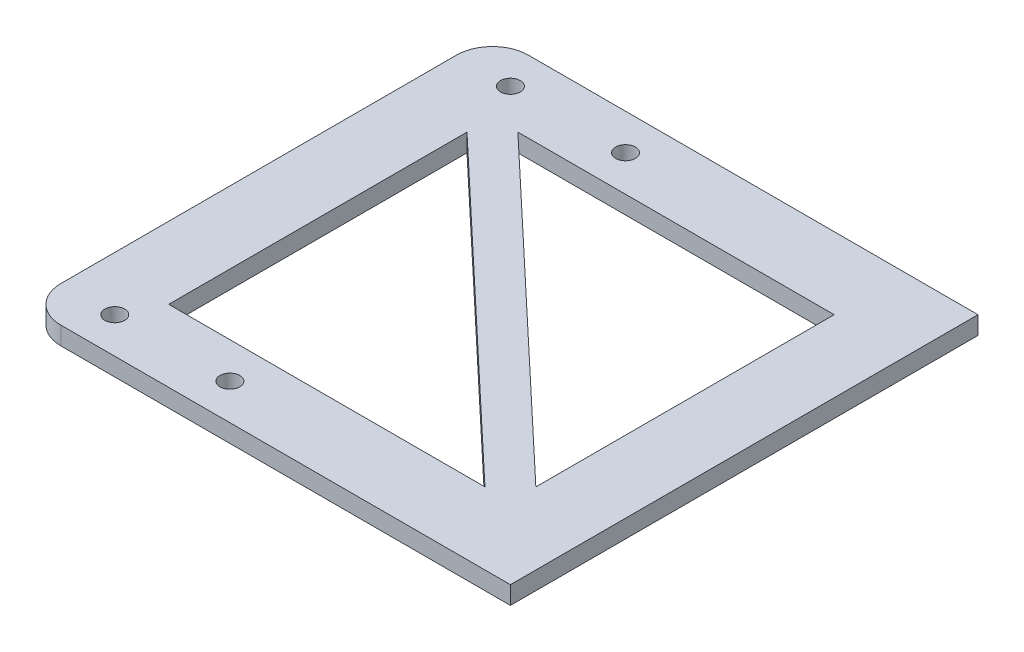
ISO-10303-21;
HEADER;
FILE_DESCRIPTION(('STEP AP214'),'2;1');
FILE_NAME('part.step','',(''),(''),'','','');
FILE_SCHEMA(('AUTOMOTIVE_DESIGN { 1 0 10303 214 1 1 1 1 }'));
ENDSEC;
DATA;
#1=APPLICATION_CONTEXT('core data for automotive mechanical design processes');
#2=APPLICATION_PROTOCOL_DEFINITION('international standard','automotive_design',2000,#1);
#3=PRODUCT_CONTEXT('',#1,'mechanical');
#4=PRODUCT('Part','Part','',(#3));
#5=PRODUCT_RELATED_PRODUCT_CATEGORY('part','',(#4));
#6=PRODUCT_DEFINITION_FORMATION('','',#4);
#7=PRODUCT_DEFINITION_CONTEXT('part definition',#1,'design');
#8=PRODUCT_DEFINITION('design','',#6,#7);
#9=PRODUCT_DEFINITION_SHAPE('','',#8);
#10=(LENGTH_UNIT() NAMED_UNIT(*) SI_UNIT(.MILLI.,.METRE.));
#11=(NAMED_UNIT(*) PLANE_ANGLE_UNIT() SI_UNIT($,.RADIAN.));
#12=(NAMED_UNIT(*) SI_UNIT($,.STERADIAN.) SOLID_ANGLE_UNIT());
#13=UNCERTAINTY_MEASURE_WITH_UNIT(LENGTH_MEASURE(1.E-05),#10,'distance_accuracy_value','');
#14=(GEOMETRIC_REPRESENTATION_CONTEXT(3) GLOBAL_UNCERTAINTY_ASSIGNED_CONTEXT((#13)) GLOBAL_UNIT_ASSIGNED_CONTEXT((#10,
#11,#12)) REPRESENTATION_CONTEXT('',''));
#15=CARTESIAN_POINT('',(0.,0.,0.));
#16=DIRECTION('',(0.,0.,1.));
#17=DIRECTION('',(1.,0.,0.));
#18=AXIS2_PLACEMENT_3D('',#15,#16,#17);
#19=CARTESIAN_POINT('',(0.,5.,0.));
#20=DIRECTION('',(0.,-1.,0.));
#21=DIRECTION('',(0.,0.,-1.));
#22=AXIS2_PLACEMENT_3D('',#19,#20,#21);
#23=PLANE('',#22);
#24=DIRECTION('',(0.,0.,-1.));
#25=VECTOR('',#24,1.);
#26=CARTESIAN_POINT('',(115.,5.,-110.));
#27=LINE('',#26,#25);
#28=CARTESIAN_POINT('',(115.,5.,-27.0740951636579));
#29=VERTEX_POINT('',#28);
#30=CARTESIAN_POINT('',(115.,5.,-110.));
#31=VERTEX_POINT('',#30);
#32=EDGE_CURVE('E164',#29,#31,#27,.T.);
#33=ORIENTED_EDGE('',*,*,#32,.F.);
#34=DIRECTION('',(0.727488889904045,0.,0.686119461220989));
#35=VECTOR('',#34,1.);
#36=CARTESIAN_POINT('',(27.0740951636579,5.,-110.));
#37=LINE('',#36,#35);
#38=CARTESIAN_POINT('',(27.0740951636579,5.,-110.));
#39=VERTEX_POINT('',#38);
#40=EDGE_CURVE('E170',#39,#29,#37,.T.);
#41=ORIENTED_EDGE('',*,*,#40,.F.);
#42=DIRECTION('',(-1.,0.,0.));
#43=VECTOR('',#42,1.);
#44=CARTESIAN_POINT('',(27.0740951636579,5.,-110.));
#45=LINE('',#44,#43);
#46=EDGE_CURVE('E166',#31,#39,#45,.T.);
#47=ORIENTED_EDGE('',*,*,#46,.F.);
#48=EDGE_LOOP('',(#33,#41,#47));
#49=FACE_BOUND('',#48,.T.);
#50=DIRECTION('',(-1.,0.,0.));
#51=VECTOR('',#50,1.);
#52=CARTESIAN_POINT('',(0.,5.,-130.));
#53=LINE('',#52,#51);
#54=CARTESIAN_POINT('',(135.,5.,-130.));
#55=VERTEX_POINT('',#54);
#56=CARTESIAN_POINT('',(10.,5.,-130.));
#57=VERTEX_POINT('',#56);
#58=EDGE_CURVE('E217',#55,#57,#53,.T.);
#59=ORIENTED_EDGE('',*,*,#58,.T.);
#60=CARTESIAN_POINT('',(10.,5.,-120.));
#61=DIRECTION('',(0.,-1.,0.));
#62=DIRECTION('',(0.,0.,-1.));
#63=AXIS2_PLACEMENT_3D('',#60,#61,#62);
#64=CIRCLE('',#63,10.);
#65=CARTESIAN_POINT('',(0.,5.,-120.));
#66=VERTEX_POINT('',#65);
#67=EDGE_CURVE('E47',#57,#66,#64,.F.);
#68=ORIENTED_EDGE('',*,*,#67,.T.);
#69=DIRECTION('',(0.,0.,1.));
#70=VECTOR('',#69,1.);
#71=CARTESIAN_POINT('',(0.,5.,0.));
#72=LINE('',#71,#70);
#73=CARTESIAN_POINT('',(0.,5.,-10.));
#74=VERTEX_POINT('',#73);
#75=EDGE_CURVE('E219',#66,#74,#72,.T.);
#76=ORIENTED_EDGE('',*,*,#75,.T.);
#77=CARTESIAN_POINT('',(10.,5.,-10.));
#78=DIRECTION('',(0.,-1.,0.));
#79=DIRECTION('',(0.,0.,-1.));
#80=AXIS2_PLACEMENT_3D('',#77,#78,#79);
#81=CIRCLE('',#80,10.);
#82=CARTESIAN_POINT('',(10.,5.,0.));
#83=VERTEX_POINT('',#82);
#84=EDGE_CURVE('E54',#74,#83,#81,.F.);
#85=ORIENTED_EDGE('',*,*,#84,.T.);
#86=DIRECTION('',(1.,0.,0.));
#87=VECTOR('',#86,1.);
#88=CARTESIAN_POINT('',(135.,5.,0.));
#89=LINE('',#88,#87);
#90=CARTESIAN_POINT('',(135.,5.,0.));
#91=VERTEX_POINT('',#90);
#92=EDGE_CURVE('E212',#83,#91,#89,.T.);
#93=ORIENTED_EDGE('',*,*,#92,.T.);
#94=DIRECTION('',(0.,0.,-1.));
#95=VECTOR('',#94,1.);
#96=CARTESIAN_POINT('',(135.,5.,-130.));
#97=LINE('',#96,#95);
#98=EDGE_CURVE('E214',#91,#55,#97,.T.);
#99=ORIENTED_EDGE('',*,*,#98,.T.);
#100=EDGE_LOOP('',(#59,#68,#76,#85,#93,#99));
#101=FACE_BOUND('',#100,.T.);
#102=CARTESIAN_POINT('',(15.,5.,-9.99999999999997));
#103=DIRECTION('',(0.,1.,0.));
#104=DIRECTION('',(0.,0.,1.));
#105=AXIS2_PLACEMENT_3D('',#102,#103,#104);
#106=CIRCLE('',#105,2.75);
#107=CARTESIAN_POINT('',(15.,5.,-7.24999999999997));
#108=VERTEX_POINT('',#107);
#109=EDGE_CURVE('E206',#108,#108,#106,.T.);
#110=ORIENTED_EDGE('',*,*,#109,.F.);
#111=EDGE_LOOP('',(#110));
#112=FACE_BOUND('',#111,.T.);
#113=CARTESIAN_POINT('',(47.,5.,-9.99999999999997));
#114=DIRECTION('',(0.,1.,0.));
#115=DIRECTION('',(0.,0.,1.));
#116=AXIS2_PLACEMENT_3D('',#113,#114,#115);
#117=CIRCLE('',#116,2.75000000000001);
#118=CARTESIAN_POINT('',(47.,5.,-7.24999999999996));
#119=VERTEX_POINT('',#118);
#120=EDGE_CURVE('E200',#119,#119,#117,.T.);
#121=ORIENTED_EDGE('',*,*,#120,.F.);
#122=EDGE_LOOP('',(#121));
#123=FACE_BOUND('',#122,.T.);
#124=CARTESIAN_POINT('',(15.,5.,-120.));
#125=DIRECTION('',(0.,1.,0.));
#126=DIRECTION('',(0.,0.,1.));
#127=AXIS2_PLACEMENT_3D('',#124,#125,#126);
#128=CIRCLE('',#127,2.75);
#129=CARTESIAN_POINT('',(15.,5.,-117.25));
#130=VERTEX_POINT('',#129);
#131=EDGE_CURVE('E194',#130,#130,#128,.T.);
#132=ORIENTED_EDGE('',*,*,#131,.F.);
#133=EDGE_LOOP('',(#132));
#134=FACE_BOUND('',#133,.T.);
#135=CARTESIAN_POINT('',(47.,5.,-120.));
#136=DIRECTION('',(0.,1.,0.));
#137=DIRECTION('',(0.,0.,1.));
#138=AXIS2_PLACEMENT_3D('',#135,#136,#137);
#139=CIRCLE('',#138,2.75000000000001);
#140=CARTESIAN_POINT('',(47.,5.,-117.25));
#141=VERTEX_POINT('',#140);
#142=EDGE_CURVE('E188',#141,#141,#139,.T.);
#143=ORIENTED_EDGE('',*,*,#142,.F.);
#144=EDGE_LOOP('',(#143));
#145=FACE_BOUND('',#144,.T.);
#146=DIRECTION('',(0.,0.,1.));
#147=VECTOR('',#146,1.);
#148=CARTESIAN_POINT('',(20.,5.,-20.));
#149=LINE('',#148,#147);
#150=CARTESIAN_POINT('',(20.,5.,-102.925904836342));
#151=VERTEX_POINT('',#150);
#152=CARTESIAN_POINT('',(20.,5.,-20.));
#153=VERTEX_POINT('',#152);
#154=EDGE_CURVE('E132',#151,#153,#149,.T.);
#155=ORIENTED_EDGE('',*,*,#154,.F.);
#156=DIRECTION('',(-0.727488889904045,0.,-0.686119461220989));
#157=VECTOR('',#156,1.);
#158=CARTESIAN_POINT('',(20.,5.,-102.925904836342));
#159=LINE('',#158,#157);
#160=CARTESIAN_POINT('',(107.925904836342,5.,-20.));
#161=VERTEX_POINT('',#160);
#162=EDGE_CURVE('E153',#161,#151,#159,.T.);
#163=ORIENTED_EDGE('',*,*,#162,.F.);
#164=DIRECTION('',(1.,0.,0.));
#165=VECTOR('',#164,1.);
#166=CARTESIAN_POINT('',(107.925904836342,5.,-20.));
#167=LINE('',#166,#165);
#168=EDGE_CURVE('E142',#153,#161,#167,.T.);
#169=ORIENTED_EDGE('',*,*,#168,.F.);
#170=EDGE_LOOP('',(#155,#163,#169));
#171=FACE_BOUND('',#170,.T.);
#172=ADVANCED_FACE('F39',(#49,#101,#112,#123,#134,#145,#171),#23,.F.);
#173=CARTESIAN_POINT('',(0.,0.,0.));
#174=DIRECTION('',(0.,-1.,0.));
#175=DIRECTION('',(0.,0.,-1.));
#176=AXIS2_PLACEMENT_3D('',#173,#174,#175);
#177=PLANE('',#176);
#178=CARTESIAN_POINT('',(15.,0.,-120.));
#179=DIRECTION('',(0.,1.,0.));
#180=DIRECTION('',(0.,0.,1.));
#181=AXIS2_PLACEMENT_3D('',#178,#179,#180);
#182=CIRCLE('',#181,2.75);
#183=CARTESIAN_POINT('',(15.,0.,-117.25));
#184=VERTEX_POINT('',#183);
#185=EDGE_CURVE('E191',#184,#184,#182,.T.);
#186=ORIENTED_EDGE('',*,*,#185,.T.);
#187=EDGE_LOOP('',(#186));
#188=FACE_BOUND('',#187,.T.);
#189=CARTESIAN_POINT('',(15.,0.,-9.99999999999997));
#190=DIRECTION('',(0.,1.,0.));
#191=DIRECTION('',(0.,0.,1.));
#192=AXIS2_PLACEMENT_3D('',#189,#190,#191);
#193=CIRCLE('',#192,2.75);
#194=CARTESIAN_POINT('',(15.,0.,-7.24999999999997));
#195=VERTEX_POINT('',#194);
#196=EDGE_CURVE('E203',#195,#195,#193,.T.);
#197=ORIENTED_EDGE('',*,*,#196,.T.);
#198=EDGE_LOOP('',(#197));
#199=FACE_BOUND('',#198,.T.);
#200=DIRECTION('',(0.,0.,1.));
#201=VECTOR('',#200,1.);
#202=CARTESIAN_POINT('',(0.,0.,0.));
#203=LINE('',#202,#201);
#204=CARTESIAN_POINT('',(0.,0.,-120.));
#205=VERTEX_POINT('',#204);
#206=CARTESIAN_POINT('',(0.,0.,-10.));
#207=VERTEX_POINT('',#206);
#208=EDGE_CURVE('E215',#205,#207,#203,.T.);
#209=ORIENTED_EDGE('',*,*,#208,.F.);
#210=CARTESIAN_POINT('',(10.,0.,-120.));
#211=DIRECTION('',(0.,-1.,0.));
#212=DIRECTION('',(0.,0.,-1.));
#213=AXIS2_PLACEMENT_3D('',#210,#211,#212);
#214=CIRCLE('',#213,10.);
#215=CARTESIAN_POINT('',(10.,0.,-130.));
#216=VERTEX_POINT('',#215);
#217=EDGE_CURVE('E241',#205,#216,#214,.T.);
#218=ORIENTED_EDGE('',*,*,#217,.T.);
#219=DIRECTION('',(-1.,0.,0.));
#220=VECTOR('',#219,1.);
#221=CARTESIAN_POINT('',(0.,0.,-130.));
#222=LINE('',#221,#220);
#223=CARTESIAN_POINT('',(135.,0.,-130.));
#224=VERTEX_POINT('',#223);
#225=EDGE_CURVE('E225',#224,#216,#222,.T.);
#226=ORIENTED_EDGE('',*,*,#225,.F.);
#227=DIRECTION('',(0.,0.,-1.));
#228=VECTOR('',#227,1.);
#229=CARTESIAN_POINT('',(135.,0.,-130.));
#230=LINE('',#229,#228);
#231=CARTESIAN_POINT('',(135.,0.,0.));
#232=VERTEX_POINT('',#231);
#233=EDGE_CURVE('E223',#232,#224,#230,.T.);
#234=ORIENTED_EDGE('',*,*,#233,.F.);
#235=DIRECTION('',(1.,0.,0.));
#236=VECTOR('',#235,1.);
#237=CARTESIAN_POINT('',(135.,0.,0.));
#238=LINE('',#237,#236);
#239=CARTESIAN_POINT('',(10.,0.,0.));
#240=VERTEX_POINT('',#239);
#241=EDGE_CURVE('E209',#240,#232,#238,.T.);
#242=ORIENTED_EDGE('',*,*,#241,.F.);
#243=CARTESIAN_POINT('',(10.,0.,-10.));
#244=DIRECTION('',(0.,-1.,0.));
#245=DIRECTION('',(0.,0.,-1.));
#246=AXIS2_PLACEMENT_3D('',#243,#244,#245);
#247=CIRCLE('',#246,10.);
#248=EDGE_CURVE('E239',#240,#207,#247,.T.);
#249=ORIENTED_EDGE('',*,*,#248,.T.);
#250=EDGE_LOOP('',(#209,#218,#226,#234,#242,#249));
#251=FACE_BOUND('',#250,.T.);
#252=CARTESIAN_POINT('',(47.,0.,-9.99999999999997));
#253=DIRECTION('',(0.,1.,0.));
#254=DIRECTION('',(0.,0.,1.));
#255=AXIS2_PLACEMENT_3D('',#252,#253,#254);
#256=CIRCLE('',#255,2.75000000000001);
#257=CARTESIAN_POINT('',(47.,0.,-7.24999999999996));
#258=VERTEX_POINT('',#257);
#259=EDGE_CURVE('E197',#258,#258,#256,.T.);
#260=ORIENTED_EDGE('',*,*,#259,.T.);
#261=EDGE_LOOP('',(#260));
#262=FACE_BOUND('',#261,.T.);
#263=CARTESIAN_POINT('',(47.,0.,-120.));
#264=DIRECTION('',(0.,1.,0.));
#265=DIRECTION('',(0.,0.,1.));
#266=AXIS2_PLACEMENT_3D('',#263,#264,#265);
#267=CIRCLE('',#266,2.75000000000001);
#268=CARTESIAN_POINT('',(47.,0.,-117.25));
#269=VERTEX_POINT('',#268);
#270=EDGE_CURVE('E187',#269,#269,#267,.T.);
#271=ORIENTED_EDGE('',*,*,#270,.T.);
#272=EDGE_LOOP('',(#271));
#273=FACE_BOUND('',#272,.T.);
#274=DIRECTION('',(0.727488889904045,0.,0.686119461220989));
#275=VECTOR('',#274,1.);
#276=CARTESIAN_POINT('',(27.0740951636579,0.,-110.));
#277=LINE('',#276,#275);
#278=CARTESIAN_POINT('',(27.0740951636579,0.,-110.));
#279=VERTEX_POINT('',#278);
#280=CARTESIAN_POINT('',(115.,0.,-27.0740951636579));
#281=VERTEX_POINT('',#280);
#282=EDGE_CURVE('E167',#279,#281,#277,.T.);
#283=ORIENTED_EDGE('',*,*,#282,.T.);
#284=DIRECTION('',(0.,0.,-1.));
#285=VECTOR('',#284,1.);
#286=CARTESIAN_POINT('',(115.,0.,-110.));
#287=LINE('',#286,#285);
#288=CARTESIAN_POINT('',(115.,0.,-110.));
#289=VERTEX_POINT('',#288);
#290=EDGE_CURVE('E150',#281,#289,#287,.T.);
#291=ORIENTED_EDGE('',*,*,#290,.T.);
#292=DIRECTION('',(-1.,0.,0.));
#293=VECTOR('',#292,1.);
#294=CARTESIAN_POINT('',(27.0740951636579,0.,-110.));
#295=LINE('',#294,#293);
#296=EDGE_CURVE('E175',#289,#279,#295,.T.);
#297=ORIENTED_EDGE('',*,*,#296,.T.);
#298=EDGE_LOOP('',(#283,#291,#297));
#299=FACE_BOUND('',#298,.T.);
#300=DIRECTION('',(-0.727488889904045,0.,-0.686119461220989));
#301=VECTOR('',#300,1.);
#302=CARTESIAN_POINT('',(20.,0.,-102.925904836342));
#303=LINE('',#302,#301);
#304=CARTESIAN_POINT('',(107.925904836342,0.,-20.));
#305=VERTEX_POINT('',#304);
#306=CARTESIAN_POINT('',(20.,0.,-102.925904836342));
#307=VERTEX_POINT('',#306);
#308=EDGE_CURVE('E143',#305,#307,#303,.T.);
#309=ORIENTED_EDGE('',*,*,#308,.T.);
#310=DIRECTION('',(0.,0.,1.));
#311=VECTOR('',#310,1.);
#312=CARTESIAN_POINT('',(20.,0.,-20.));
#313=LINE('',#312,#311);
#314=CARTESIAN_POINT('',(20.,0.,-20.));
#315=VERTEX_POINT('',#314);
#316=EDGE_CURVE('E157',#307,#315,#313,.T.);
#317=ORIENTED_EDGE('',*,*,#316,.T.);
#318=DIRECTION('',(1.,0.,0.));
#319=VECTOR('',#318,1.);
#320=CARTESIAN_POINT('',(107.925904836342,0.,-20.));
#321=LINE('',#320,#319);
#322=EDGE_CURVE('E149',#315,#305,#321,.T.);
#323=ORIENTED_EDGE('',*,*,#322,.T.);
#324=EDGE_LOOP('',(#309,#317,#323));
#325=FACE_BOUND('',#324,.T.);
#326=ADVANCED_FACE('F256',(#188,#199,#251,#262,#273,#299,#325),#177,.T.);
#327=CARTESIAN_POINT('',(135.,5.,0.));
#328=DIRECTION('',(0.,0.,-1.));
#329=DIRECTION('',(-1.,0.,0.));
#330=AXIS2_PLACEMENT_3D('',#327,#328,#329);
#331=PLANE('',#330);
#332=ORIENTED_EDGE('',*,*,#92,.F.);
#333=DIRECTION('',(0.,-1.,0.));
#334=VECTOR('',#333,1.);
#335=CARTESIAN_POINT('',(10.,5.,0.));
#336=LINE('',#335,#334);
#337=EDGE_CURVE('E11',#83,#240,#336,.T.);
#338=ORIENTED_EDGE('',*,*,#337,.T.);
#339=ORIENTED_EDGE('',*,*,#241,.T.);
#340=DIRECTION('',(0.,-1.,0.));
#341=VECTOR('',#340,1.);
#342=CARTESIAN_POINT('',(135.,5.,0.));
#343=LINE('',#342,#341);
#344=EDGE_CURVE('E231',#91,#232,#343,.T.);
#345=ORIENTED_EDGE('',*,*,#344,.F.);
#346=EDGE_LOOP('',(#332,#338,#339,#345));
#347=FACE_BOUND('',#346,.T.);
#348=ADVANCED_FACE('F267',(#347),#331,.F.);
#349=CARTESIAN_POINT('',(135.,5.,-130.));
#350=DIRECTION('',(-1.,0.,0.));
#351=DIRECTION('',(0.,0.,1.));
#352=AXIS2_PLACEMENT_3D('',#349,#350,#351);
#353=PLANE('',#352);
#354=ORIENTED_EDGE('',*,*,#233,.T.);
#355=DIRECTION('',(0.,-1.,0.));
#356=VECTOR('',#355,1.);
#357=CARTESIAN_POINT('',(135.,5.,-130.));
#358=LINE('',#357,#356);
#359=EDGE_CURVE('E221',#55,#224,#358,.T.);
#360=ORIENTED_EDGE('',*,*,#359,.F.);
#361=ORIENTED_EDGE('',*,*,#98,.F.);
#362=ORIENTED_EDGE('',*,*,#344,.T.);
#363=EDGE_LOOP('',(#354,#360,#361,#362));
#364=FACE_BOUND('',#363,.T.);
#365=ADVANCED_FACE('F263',(#364),#353,.F.);
#366=CARTESIAN_POINT('',(0.,5.,-130.));
#367=DIRECTION('',(0.,0.,1.));
#368=DIRECTION('',(1.,0.,0.));
#369=AXIS2_PLACEMENT_3D('',#366,#367,#368);
#370=PLANE('',#369);
#371=ORIENTED_EDGE('',*,*,#225,.T.);
#372=DIRECTION('',(0.,-1.,0.));
#373=VECTOR('',#372,1.);
#374=CARTESIAN_POINT('',(10.,5.,-130.));
#375=LINE('',#374,#373);
#376=EDGE_CURVE('E62',#216,#57,#375,.F.);
#377=ORIENTED_EDGE('',*,*,#376,.T.);
#378=ORIENTED_EDGE('',*,*,#58,.F.);
#379=ORIENTED_EDGE('',*,*,#359,.T.);
#380=EDGE_LOOP('',(#371,#377,#378,#379));
#381=FACE_BOUND('',#380,.T.);
#382=ADVANCED_FACE('F259',(#381),#370,.F.);
#383=CARTESIAN_POINT('',(0.,5.,0.));
#384=DIRECTION('',(1.,0.,0.));
#385=DIRECTION('',(0.,0.,-1.));
#386=AXIS2_PLACEMENT_3D('',#383,#384,#385);
#387=PLANE('',#386);
#388=ORIENTED_EDGE('',*,*,#75,.F.);
#389=DIRECTION('',(0.,-1.,0.));
#390=VECTOR('',#389,1.);
#391=CARTESIAN_POINT('',(0.,5.,-120.));
#392=LINE('',#391,#390);
#393=EDGE_CURVE('E236',#66,#205,#392,.T.);
#394=ORIENTED_EDGE('',*,*,#393,.T.);
#395=ORIENTED_EDGE('',*,*,#208,.T.);
#396=DIRECTION('',(0.,-1.,0.));
#397=VECTOR('',#396,1.);
#398=CARTESIAN_POINT('',(0.,5.,-10.));
#399=LINE('',#398,#397);
#400=EDGE_CURVE('E234',#207,#74,#399,.F.);
#401=ORIENTED_EDGE('',*,*,#400,.T.);
#402=EDGE_LOOP('',(#388,#394,#395,#401));
#403=FACE_BOUND('',#402,.T.);
#404=ADVANCED_FACE('F250',(#403),#387,.F.);
#405=CARTESIAN_POINT('',(15.,5.,-9.99999999999997));
#406=DIRECTION('',(0.,-1.,0.));
#407=DIRECTION('',(0.,0.,-1.));
#408=AXIS2_PLACEMENT_3D('',#405,#406,#407);
#409=CYLINDRICAL_SURFACE('',#408,2.75);
#410=ORIENTED_EDGE('',*,*,#109,.T.);
#411=EDGE_LOOP('',(#410));
#412=FACE_BOUND('',#411,.T.);
#413=ORIENTED_EDGE('',*,*,#196,.F.);
#414=EDGE_LOOP('',(#413));
#415=FACE_BOUND('',#414,.T.);
#416=ADVANCED_FACE('F286',(#412,#415),#409,.F.);
#417=CARTESIAN_POINT('',(47.,5.,-9.99999999999997));
#418=DIRECTION('',(0.,-1.,0.));
#419=DIRECTION('',(0.,0.,-1.));
#420=AXIS2_PLACEMENT_3D('',#417,#418,#419);
#421=CYLINDRICAL_SURFACE('',#420,2.75000000000001);
#422=ORIENTED_EDGE('',*,*,#120,.T.);
#423=EDGE_LOOP('',(#422));
#424=FACE_BOUND('',#423,.T.);
#425=ORIENTED_EDGE('',*,*,#259,.F.);
#426=EDGE_LOOP('',(#425));
#427=FACE_BOUND('',#426,.T.);
#428=ADVANCED_FACE('F396',(#424,#427),#421,.F.);
#429=CARTESIAN_POINT('',(15.,5.,-120.));
#430=DIRECTION('',(0.,-1.,0.));
#431=DIRECTION('',(0.,0.,-1.));
#432=AXIS2_PLACEMENT_3D('',#429,#430,#431);
#433=CYLINDRICAL_SURFACE('',#432,2.75);
#434=ORIENTED_EDGE('',*,*,#131,.T.);
#435=EDGE_LOOP('',(#434));
#436=FACE_BOUND('',#435,.T.);
#437=ORIENTED_EDGE('',*,*,#185,.F.);
#438=EDGE_LOOP('',(#437));
#439=FACE_BOUND('',#438,.T.);
#440=ADVANCED_FACE('F386',(#436,#439),#433,.F.);
#441=CARTESIAN_POINT('',(47.,5.,-120.));
#442=DIRECTION('',(0.,-1.,0.));
#443=DIRECTION('',(0.,0.,-1.));
#444=AXIS2_PLACEMENT_3D('',#441,#442,#443);
#445=CYLINDRICAL_SURFACE('',#444,2.75000000000001);
#446=ORIENTED_EDGE('',*,*,#142,.T.);
#447=EDGE_LOOP('',(#446));
#448=FACE_BOUND('',#447,.T.);
#449=ORIENTED_EDGE('',*,*,#270,.F.);
#450=EDGE_LOOP('',(#449));
#451=FACE_BOUND('',#450,.T.);
#452=ADVANCED_FACE('F376',(#448,#451),#445,.F.);
#453=CARTESIAN_POINT('',(115.,5.,-110.));
#454=DIRECTION('',(-1.,0.,0.));
#455=DIRECTION('',(0.,0.,1.));
#456=AXIS2_PLACEMENT_3D('',#453,#454,#455);
#457=PLANE('',#456);
#458=ORIENTED_EDGE('',*,*,#290,.F.);
#459=DIRECTION('',(0.,-1.,0.));
#460=VECTOR('',#459,1.);
#461=CARTESIAN_POINT('',(115.,5.,-27.0740951636579));
#462=LINE('',#461,#460);
#463=EDGE_CURVE('E172',#29,#281,#462,.T.);
#464=ORIENTED_EDGE('',*,*,#463,.F.);
#465=ORIENTED_EDGE('',*,*,#32,.T.);
#466=DIRECTION('',(0.,-1.,0.));
#467=VECTOR('',#466,1.);
#468=CARTESIAN_POINT('',(115.,5.,-110.));
#469=LINE('',#468,#467);
#470=EDGE_CURVE('E184',#31,#289,#469,.T.);
#471=ORIENTED_EDGE('',*,*,#470,.T.);
#472=EDGE_LOOP('',(#458,#464,#465,#471));
#473=FACE_BOUND('',#472,.T.);
#474=ADVANCED_FACE('F366',(#473),#457,.T.);
#475=CARTESIAN_POINT('',(27.0740951636579,5.,-110.));
#476=DIRECTION('',(0.,0.,1.));
#477=DIRECTION('',(1.,0.,0.));
#478=AXIS2_PLACEMENT_3D('',#475,#476,#477);
#479=PLANE('',#478);
#480=ORIENTED_EDGE('',*,*,#296,.F.);
#481=ORIENTED_EDGE('',*,*,#470,.F.);
#482=ORIENTED_EDGE('',*,*,#46,.T.);
#483=DIRECTION('',(0.,-1.,0.));
#484=VECTOR('',#483,1.);
#485=CARTESIAN_POINT('',(27.0740951636579,5.,-110.));
#486=LINE('',#485,#484);
#487=EDGE_CURVE('E182',#39,#279,#486,.T.);
#488=ORIENTED_EDGE('',*,*,#487,.T.);
#489=EDGE_LOOP('',(#480,#481,#482,#488));
#490=FACE_BOUND('',#489,.T.);
#491=ADVANCED_FACE('F356',(#490),#479,.T.);
#492=CARTESIAN_POINT('',(27.0740951636579,5.,-110.));
#493=DIRECTION('',(0.686119461220989,0.,-0.727488889904045));
#494=DIRECTION('',(-0.727488889904045,0.,-0.686119461220989));
#495=AXIS2_PLACEMENT_3D('',#492,#493,#494);
#496=PLANE('',#495);
#497=ORIENTED_EDGE('',*,*,#282,.F.);
#498=ORIENTED_EDGE('',*,*,#487,.F.);
#499=ORIENTED_EDGE('',*,*,#40,.T.);
#500=ORIENTED_EDGE('',*,*,#463,.T.);
#501=EDGE_LOOP('',(#497,#498,#499,#500));
#502=FACE_BOUND('',#501,.T.);
#503=ADVANCED_FACE('F347',(#502),#496,.T.);
#504=CARTESIAN_POINT('',(20.,5.,-20.));
#505=DIRECTION('',(1.,0.,0.));
#506=DIRECTION('',(0.,0.,-1.));
#507=AXIS2_PLACEMENT_3D('',#504,#505,#506);
#508=PLANE('',#507);
#509=ORIENTED_EDGE('',*,*,#316,.F.);
#510=DIRECTION('',(0.,-1.,0.));
#511=VECTOR('',#510,1.);
#512=CARTESIAN_POINT('',(20.,5.,-102.925904836342));
#513=LINE('',#512,#511);
#514=EDGE_CURVE('E138',#151,#307,#513,.T.);
#515=ORIENTED_EDGE('',*,*,#514,.F.);
#516=ORIENTED_EDGE('',*,*,#154,.T.);
#517=DIRECTION('',(0.,-1.,0.));
#518=VECTOR('',#517,1.);
#519=CARTESIAN_POINT('',(20.,5.,-20.));
#520=LINE('',#519,#518);
#521=EDGE_CURVE('E135',#153,#315,#520,.T.);
#522=ORIENTED_EDGE('',*,*,#521,.T.);
#523=EDGE_LOOP('',(#509,#515,#516,#522));
#524=FACE_BOUND('',#523,.T.);
#525=ADVANCED_FACE('F134',(#524),#508,.T.);
#526=CARTESIAN_POINT('',(107.925904836342,5.,-20.));
#527=DIRECTION('',(0.,0.,-1.));
#528=DIRECTION('',(-1.,0.,0.));
#529=AXIS2_PLACEMENT_3D('',#526,#527,#528);
#530=PLANE('',#529);
#531=ORIENTED_EDGE('',*,*,#322,.F.);
#532=ORIENTED_EDGE('',*,*,#521,.F.);
#533=ORIENTED_EDGE('',*,*,#168,.T.);
#534=DIRECTION('',(0.,-1.,0.));
#535=VECTOR('',#534,1.);
#536=CARTESIAN_POINT('',(107.925904836342,5.,-20.));
#537=LINE('',#536,#535);
#538=EDGE_CURVE('E151',#161,#305,#537,.T.);
#539=ORIENTED_EDGE('',*,*,#538,.T.);
#540=EDGE_LOOP('',(#531,#532,#533,#539));
#541=FACE_BOUND('',#540,.T.);
#542=ADVANCED_FACE('F147',(#541),#530,.T.);
#543=CARTESIAN_POINT('',(20.,5.,-102.925904836342));
#544=DIRECTION('',(-0.686119461220989,0.,0.727488889904045));
#545=DIRECTION('',(0.727488889904045,0.,0.686119461220989));
#546=AXIS2_PLACEMENT_3D('',#543,#544,#545);
#547=PLANE('',#546);
#548=ORIENTED_EDGE('',*,*,#308,.F.);
#549=ORIENTED_EDGE('',*,*,#538,.F.);
#550=ORIENTED_EDGE('',*,*,#162,.T.);
#551=ORIENTED_EDGE('',*,*,#514,.T.);
#552=EDGE_LOOP('',(#548,#549,#550,#551));
#553=FACE_BOUND('',#552,.T.);
#554=ADVANCED_FACE('F274',(#553),#547,.T.);
#555=CARTESIAN_POINT('',(10.,5.,-120.));
#556=DIRECTION('',(0.,-1.,0.));
#557=DIRECTION('',(0.,0.,-1.));
#558=AXIS2_PLACEMENT_3D('',#555,#556,#557);
#559=CYLINDRICAL_SURFACE('',#558,10.);
#560=ORIENTED_EDGE('',*,*,#67,.F.);
#561=ORIENTED_EDGE('',*,*,#376,.F.);
#562=ORIENTED_EDGE('',*,*,#217,.F.);
#563=ORIENTED_EDGE('',*,*,#393,.F.);
#564=EDGE_LOOP('',(#560,#561,#562,#563));
#565=FACE_BOUND('',#564,.T.);
#566=ADVANCED_FACE('F253',(#565),#559,.T.);
#567=CARTESIAN_POINT('',(10.,5.,-10.));
#568=DIRECTION('',(0.,-1.,0.));
#569=DIRECTION('',(0.,0.,-1.));
#570=AXIS2_PLACEMENT_3D('',#567,#568,#569);
#571=CYLINDRICAL_SURFACE('',#570,10.);
#572=ORIENTED_EDGE('',*,*,#84,.F.);
#573=ORIENTED_EDGE('',*,*,#400,.F.);
#574=ORIENTED_EDGE('',*,*,#248,.F.);
#575=ORIENTED_EDGE('',*,*,#337,.F.);
#576=EDGE_LOOP('',(#572,#573,#574,#575));
#577=FACE_BOUND('',#576,.T.);
#578=ADVANCED_FACE('F41',(#577),#571,.T.);
#579=CLOSED_SHELL('',(#172,#326,#348,#365,#382,#404,#416,#428,#440,#452,#474,#491,#503,#525,
#542,#554,#566,#578));
#580=MANIFOLD_SOLID_BREP('B2',#579);
#581=ADVANCED_BREP_SHAPE_REPRESENTATION('',(#18,#580),#14);
#582=SHAPE_DEFINITION_REPRESENTATION(#9,#581);
ENDSEC;
END-ISO-10303-21;
